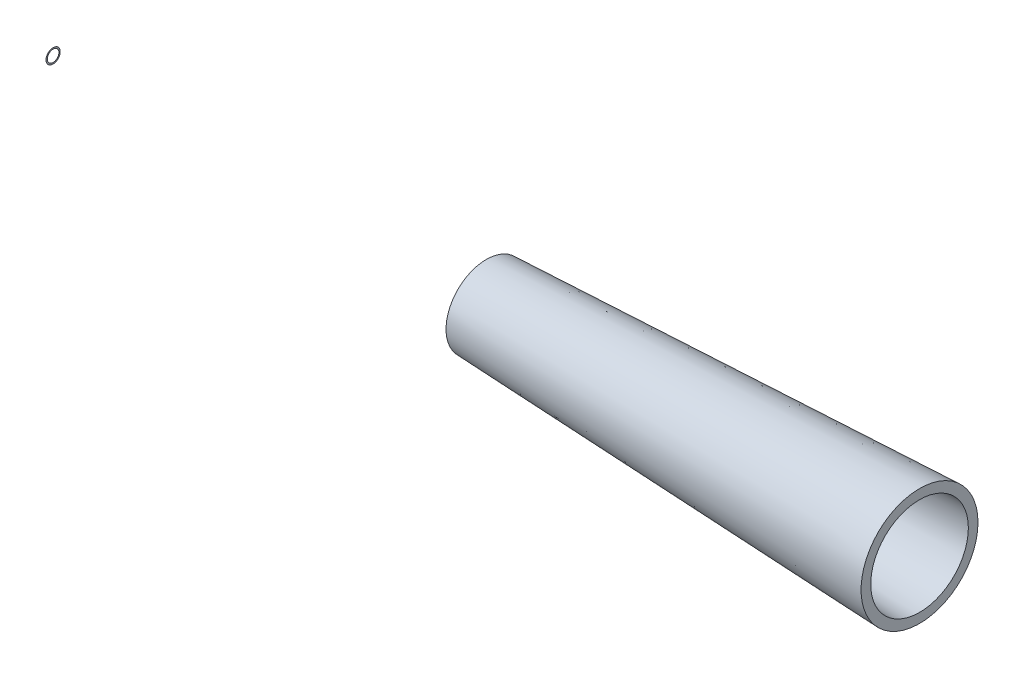
ISO-10303-21;
HEADER;
FILE_DESCRIPTION(('STEP AP214'),'2;1');
FILE_NAME('part.step','',(''),(''),'','','');
FILE_SCHEMA(('AUTOMOTIVE_DESIGN { 1 0 10303 214 1 1 1 1 }'));
ENDSEC;
DATA;
#1=APPLICATION_CONTEXT('core data for automotive mechanical design processes');
#2=APPLICATION_PROTOCOL_DEFINITION('international standard','automotive_design',2000,#1);
#3=PRODUCT_CONTEXT('',#1,'mechanical');
#4=PRODUCT('Part','Part','',(#3));
#5=PRODUCT_RELATED_PRODUCT_CATEGORY('part','',(#4));
#6=PRODUCT_DEFINITION_FORMATION('','',#4);
#7=PRODUCT_DEFINITION_CONTEXT('part definition',#1,'design');
#8=PRODUCT_DEFINITION('design','',#6,#7);
#9=PRODUCT_DEFINITION_SHAPE('','',#8);
#10=(LENGTH_UNIT() NAMED_UNIT(*) SI_UNIT(.MILLI.,.METRE.));
#11=(NAMED_UNIT(*) PLANE_ANGLE_UNIT() SI_UNIT($,.RADIAN.));
#12=(NAMED_UNIT(*) SI_UNIT($,.STERADIAN.) SOLID_ANGLE_UNIT());
#13=UNCERTAINTY_MEASURE_WITH_UNIT(LENGTH_MEASURE(1.E-05),#10,'distance_accuracy_value','');
#14=(GEOMETRIC_REPRESENTATION_CONTEXT(3) GLOBAL_UNCERTAINTY_ASSIGNED_CONTEXT((#13)) GLOBAL_UNIT_ASSIGNED_CONTEXT((#10,
#11,#12)) REPRESENTATION_CONTEXT('',''));
#15=CARTESIAN_POINT('',(0.,0.,0.));
#16=DIRECTION('',(0.,0.,1.));
#17=DIRECTION('',(1.,0.,0.));
#18=AXIS2_PLACEMENT_3D('',#15,#16,#17);
#19=CARTESIAN_POINT('',(50.,0.,0.));
#20=DIRECTION('',(1.,0.,0.));
#21=DIRECTION('',(0.,0.,-1.));
#22=AXIS2_PLACEMENT_3D('',#19,#20,#21);
#23=CONICAL_SURFACE('',#22,4.69458471716816,0.0418879020478642);
#24=CARTESIAN_POINT('',(90.,0.,0.));
#25=DIRECTION('',(1.,0.,0.));
#26=DIRECTION('',(0.,0.,-1.));
#27=AXIS2_PLACEMENT_3D('',#24,#25,#26);
#28=CIRCLE('',#27,6.37108143879974);
#29=CARTESIAN_POINT('',(90.,0.,-6.37108143879974));
#30=VERTEX_POINT('',#29);
#31=EDGE_CURVE('E12',#30,#30,#28,.T.);
#32=ORIENTED_EDGE('',*,*,#31,.F.);
#33=EDGE_LOOP('',(#32));
#34=FACE_BOUND('',#33,.T.);
#35=CARTESIAN_POINT('',(180.,0.,0.));
#36=DIRECTION('',(1.,0.,0.));
#37=DIRECTION('',(0.,0.,-1.));
#38=AXIS2_PLACEMENT_3D('',#35,#36,#37);
#39=CIRCLE('',#38,10.1431990624708);
#40=CARTESIAN_POINT('',(180.,0.,-10.1431990624708));
#41=VERTEX_POINT('',#40);
#42=EDGE_CURVE('E66',#41,#41,#39,.T.);
#43=ORIENTED_EDGE('',*,*,#42,.T.);
#44=EDGE_LOOP('',(#43));
#45=FACE_BOUND('',#44,.T.);
#46=ADVANCED_FACE('F53',(#34,#45),#23,.F.);
#47=CARTESIAN_POINT('',(180.,10.1431990624708,0.));
#48=DIRECTION('',(1.,0.,0.));
#49=DIRECTION('',(0.,0.,-1.));
#50=AXIS2_PLACEMENT_3D('',#47,#48,#49);
#51=PLANE('',#50);
#52=CARTESIAN_POINT('',(180.,0.,0.));
#53=DIRECTION('',(1.,0.,0.));
#54=DIRECTION('',(0.,0.,-1.));
#55=AXIS2_PLACEMENT_3D('',#52,#53,#54);
#56=CIRCLE('',#55,12.1449549424782);
#57=CARTESIAN_POINT('',(180.,0.,-12.1449549424782));
#58=VERTEX_POINT('',#57);
#59=EDGE_CURVE('E68',#58,#58,#56,.T.);
#60=ORIENTED_EDGE('',*,*,#59,.T.);
#61=EDGE_LOOP('',(#60));
#62=FACE_BOUND('',#61,.T.);
#63=ORIENTED_EDGE('',*,*,#42,.F.);
#64=EDGE_LOOP('',(#63));
#65=FACE_BOUND('',#64,.T.);
#66=ADVANCED_FACE('F76',(#62,#65),#51,.T.);
#67=CARTESIAN_POINT('',(180.,0.,0.));
#68=DIRECTION('',(1.,0.,0.));
#69=DIRECTION('',(0.,0.,-1.));
#70=AXIS2_PLACEMENT_3D('',#67,#68,#69);
#71=CONICAL_SURFACE('',#70,12.1449549424782,0.0418879020478642);
#72=CARTESIAN_POINT('',(90.,0.,0.));
#73=DIRECTION('',(1.,0.,0.));
#74=DIRECTION('',(0.,0.,-1.));
#75=AXIS2_PLACEMENT_3D('',#72,#73,#74);
#76=CIRCLE('',#75,8.37283731880711);
#77=CARTESIAN_POINT('',(90.,0.,-8.37283731880711));
#78=VERTEX_POINT('',#77);
#79=EDGE_CURVE('E56',#78,#78,#76,.F.);
#80=ORIENTED_EDGE('',*,*,#79,.F.);
#81=EDGE_LOOP('',(#80));
#82=FACE_BOUND('',#81,.T.);
#83=ORIENTED_EDGE('',*,*,#59,.F.);
#84=EDGE_LOOP('',(#83));
#85=FACE_BOUND('',#84,.T.);
#86=ADVANCED_FACE('F78',(#82,#85),#71,.T.);
#87=CARTESIAN_POINT('',(90.,0.,0.));
#88=DIRECTION('',(1.,0.,0.));
#89=DIRECTION('',(0.,0.,-1.));
#90=AXIS2_PLACEMENT_3D('',#87,#88,#89);
#91=PLANE('',#90);
#92=ORIENTED_EDGE('',*,*,#31,.T.);
#93=EDGE_LOOP('',(#92));
#94=FACE_BOUND('',#93,.T.);
#95=ORIENTED_EDGE('',*,*,#79,.T.);
#96=EDGE_LOOP('',(#95));
#97=FACE_BOUND('',#96,.T.);
#98=ADVANCED_FACE('F84',(#94,#97),#91,.F.);
#99=CLOSED_SHELL('',(#46,#66,#86,#98));
#100=MANIFOLD_SOLID_BREP('B2',#99);
#101=CARTESIAN_POINT('',(0.,0.,0.));
#102=DIRECTION('',(1.,0.,0.));
#103=DIRECTION('',(0.,0.,-1.));
#104=AXIS2_PLACEMENT_3D('',#101,#102,#103);
#105=PLANE('',#104);
#106=CARTESIAN_POINT('',(0.,0.,0.));
#107=DIRECTION('',(-1.,0.,0.));
#108=DIRECTION('',(0.,0.,1.));
#109=AXIS2_PLACEMENT_3D('',#106,#107,#108);
#110=CIRCLE('',#109,1.2);
#111=CARTESIAN_POINT('',(0.,0.,1.2));
#112=VERTEX_POINT('',#111);
#113=EDGE_CURVE('E131',#112,#112,#110,.T.);
#114=ORIENTED_EDGE('',*,*,#113,.T.);
#115=EDGE_LOOP('',(#114));
#116=FACE_BOUND('',#115,.T.);
#117=CARTESIAN_POINT('',(0.,0.,0.));
#118=DIRECTION('',(1.,0.,0.));
#119=DIRECTION('',(0.,0.,-1.));
#120=AXIS2_PLACEMENT_3D('',#117,#118,#119);
#121=CIRCLE('',#120,1.47834620192007);
#122=CARTESIAN_POINT('',(0.,0.,-1.47834620192007));
#123=VERTEX_POINT('',#122);
#124=EDGE_CURVE('E52',#123,#123,#121,.T.);
#125=ORIENTED_EDGE('',*,*,#124,.T.);
#126=EDGE_LOOP('',(#125));
#127=FACE_BOUND('',#126,.T.);
#128=ADVANCED_FACE('F127',(#116,#127),#105,.T.);
#129=CARTESIAN_POINT('',(1.99026806874157,0.,0.));
#130=DIRECTION('',(-1.,0.,0.));
#131=DIRECTION('',(0.,0.,1.));
#132=AXIS2_PLACEMENT_3D('',#129,#130,#131);
#133=DEGENERATE_TOROIDAL_SURFACE('',#132,1.33917310096007,1.99512810051965,.T.);
#134=ORIENTED_EDGE('',*,*,#113,.F.);
#135=EDGE_LOOP('',(#134));
#136=FACE_BOUND('',#135,.T.);
#137=ORIENTED_EDGE('',*,*,#124,.F.);
#138=EDGE_LOOP('',(#137));
#139=FACE_BOUND('',#138,.T.);
#140=ADVANCED_FACE('F129',(#136,#139),#133,.T.);
#141=CLOSED_SHELL('',(#128,#140));
#142=MANIFOLD_SOLID_BREP('B7',#141);
#143=ADVANCED_BREP_SHAPE_REPRESENTATION('',(#18,#100,#142),#14);
#144=SHAPE_DEFINITION_REPRESENTATION(#9,#143);
ENDSEC;
END-ISO-10303-21;
